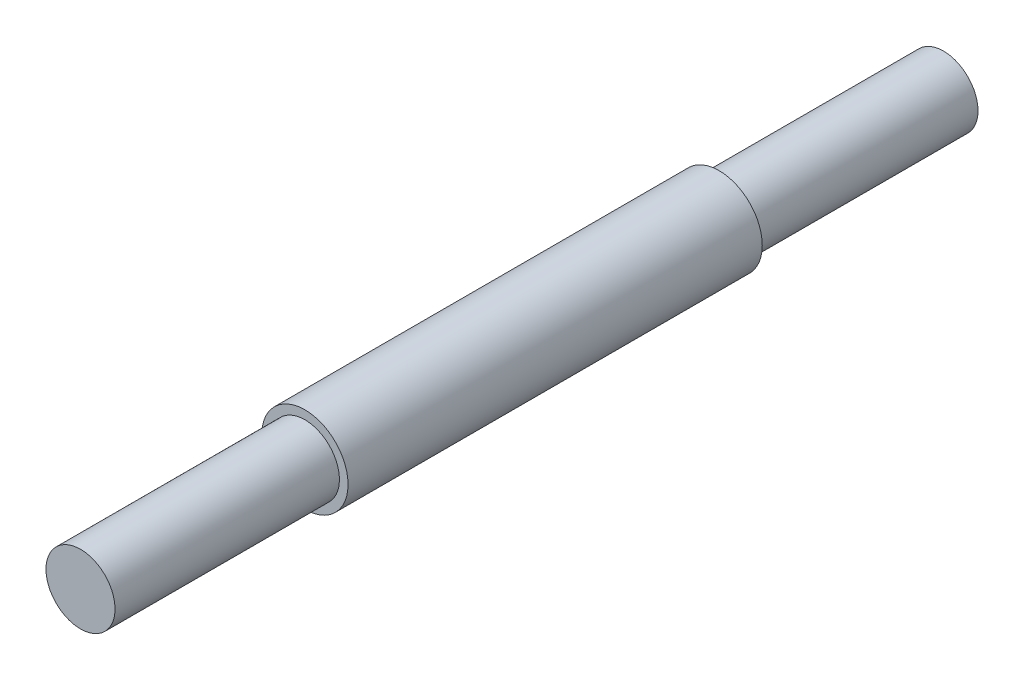
ISO-10303-21;
HEADER;
FILE_DESCRIPTION(('STEP AP214'),'2;1');
FILE_NAME('part.step','',(''),(''),'','','');
FILE_SCHEMA(('AUTOMOTIVE_DESIGN { 1 0 10303 214 1 1 1 1 }'));
ENDSEC;
DATA;
#1=APPLICATION_CONTEXT('core data for automotive mechanical design processes');
#2=APPLICATION_PROTOCOL_DEFINITION('international standard','automotive_design',2000,#1);
#3=PRODUCT_CONTEXT('',#1,'mechanical');
#4=PRODUCT('Part','Part','',(#3));
#5=PRODUCT_RELATED_PRODUCT_CATEGORY('part','',(#4));
#6=PRODUCT_DEFINITION_FORMATION('','',#4);
#7=PRODUCT_DEFINITION_CONTEXT('part definition',#1,'design');
#8=PRODUCT_DEFINITION('design','',#6,#7);
#9=PRODUCT_DEFINITION_SHAPE('','',#8);
#10=(LENGTH_UNIT() NAMED_UNIT(*) SI_UNIT(.MILLI.,.METRE.));
#11=(NAMED_UNIT(*) PLANE_ANGLE_UNIT() SI_UNIT($,.RADIAN.));
#12=(NAMED_UNIT(*) SI_UNIT($,.STERADIAN.) SOLID_ANGLE_UNIT());
#13=UNCERTAINTY_MEASURE_WITH_UNIT(LENGTH_MEASURE(1.E-05),#10,'distance_accuracy_value','');
#14=(GEOMETRIC_REPRESENTATION_CONTEXT(3) GLOBAL_UNCERTAINTY_ASSIGNED_CONTEXT((#13)) GLOBAL_UNIT_ASSIGNED_CONTEXT((#10,
#11,#12)) REPRESENTATION_CONTEXT('',''));
#15=CARTESIAN_POINT('',(0.,0.,0.));
#16=DIRECTION('',(0.,0.,1.));
#17=DIRECTION('',(1.,0.,0.));
#18=AXIS2_PLACEMENT_3D('',#15,#16,#17);
#19=CARTESIAN_POINT('',(0.,0.,-24.));
#20=DIRECTION('',(0.,0.,1.));
#21=DIRECTION('',(1.,0.,0.));
#22=AXIS2_PLACEMENT_3D('',#19,#20,#21);
#23=CYLINDRICAL_SURFACE('',#22,2.5);
#24=CARTESIAN_POINT('',(0.,0.,-24.));
#25=DIRECTION('',(0.,0.,1.));
#26=DIRECTION('',(1.,0.,0.));
#27=AXIS2_PLACEMENT_3D('',#24,#25,#26);
#28=CIRCLE('',#27,2.5);
#29=CARTESIAN_POINT('',(2.5,0.,-24.));
#30=VERTEX_POINT('',#29);
#31=EDGE_CURVE('E39',#30,#30,#28,.T.);
#32=ORIENTED_EDGE('',*,*,#31,.T.);
#33=EDGE_LOOP('',(#32));
#34=FACE_BOUND('',#33,.T.);
#35=CARTESIAN_POINT('',(0.,0.,0.));
#36=DIRECTION('',(0.,0.,1.));
#37=DIRECTION('',(1.,0.,0.));
#38=AXIS2_PLACEMENT_3D('',#35,#36,#37);
#39=CIRCLE('',#38,2.5);
#40=CARTESIAN_POINT('',(2.5,0.,0.));
#41=VERTEX_POINT('',#40);
#42=EDGE_CURVE('E43',#41,#41,#39,.T.);
#43=ORIENTED_EDGE('',*,*,#42,.F.);
#44=EDGE_LOOP('',(#43));
#45=FACE_BOUND('',#44,.T.);
#46=ADVANCED_FACE('F33',(#34,#45),#23,.T.);
#47=CARTESIAN_POINT('',(0.,0.,-24.));
#48=DIRECTION('',(0.,0.,1.));
#49=DIRECTION('',(1.,0.,0.));
#50=AXIS2_PLACEMENT_3D('',#47,#48,#49);
#51=PLANE('',#50);
#52=CARTESIAN_POINT('',(0.,0.,-24.));
#53=DIRECTION('',(0.,0.,1.));
#54=DIRECTION('',(1.,0.,0.));
#55=AXIS2_PLACEMENT_3D('',#52,#53,#54);
#56=CIRCLE('',#55,2.);
#57=CARTESIAN_POINT('',(2.,0.,-24.));
#58=VERTEX_POINT('',#57);
#59=EDGE_CURVE('E10',#58,#58,#56,.F.);
#60=ORIENTED_EDGE('',*,*,#59,.F.);
#61=EDGE_LOOP('',(#60));
#62=FACE_BOUND('',#61,.T.);
#63=ORIENTED_EDGE('',*,*,#31,.F.);
#64=EDGE_LOOP('',(#63));
#65=FACE_BOUND('',#64,.T.);
#66=ADVANCED_FACE('F74',(#62,#65),#51,.F.);
#67=CARTESIAN_POINT('',(0.,0.,0.));
#68=DIRECTION('',(0.,0.,1.));
#69=DIRECTION('',(1.,0.,0.));
#70=AXIS2_PLACEMENT_3D('',#67,#68,#69);
#71=PLANE('',#70);
#72=CARTESIAN_POINT('',(0.,0.,0.));
#73=DIRECTION('',(0.,0.,1.));
#74=DIRECTION('',(1.,0.,0.));
#75=AXIS2_PLACEMENT_3D('',#72,#73,#74);
#76=CIRCLE('',#75,2.);
#77=CARTESIAN_POINT('',(-2.,0.,0.));
#78=VERTEX_POINT('',#77);
#79=EDGE_CURVE('E50',#78,#78,#76,.T.);
#80=ORIENTED_EDGE('',*,*,#79,.F.);
#81=EDGE_LOOP('',(#80));
#82=FACE_BOUND('',#81,.T.);
#83=ORIENTED_EDGE('',*,*,#42,.T.);
#84=EDGE_LOOP('',(#83));
#85=FACE_BOUND('',#84,.T.);
#86=ADVANCED_FACE('F78',(#82,#85),#71,.T.);
#87=CARTESIAN_POINT('',(0.,0.,13.));
#88=DIRECTION('',(0.,0.,-1.));
#89=DIRECTION('',(-1.,0.,0.));
#90=AXIS2_PLACEMENT_3D('',#87,#88,#89);
#91=CYLINDRICAL_SURFACE('',#90,2.);
#92=CARTESIAN_POINT('',(0.,0.,13.));
#93=DIRECTION('',(0.,0.,1.));
#94=DIRECTION('',(1.,0.,0.));
#95=AXIS2_PLACEMENT_3D('',#92,#93,#94);
#96=CIRCLE('',#95,2.);
#97=CARTESIAN_POINT('',(-2.,0.,13.));
#98=VERTEX_POINT('',#97);
#99=EDGE_CURVE('E48',#98,#98,#96,.T.);
#100=CARTESIAN_POINT('',(-2.,0.,13.));
#101=CARTESIAN_POINT('',(-2.,0.,12.8645833333333));
#102=CARTESIAN_POINT('',(-2.,0.,12.7291666666667));
#103=CARTESIAN_POINT('',(-2.,0.,12.4583333333333));
#104=CARTESIAN_POINT('',(-2.,0.,12.3229166666667));
#105=CARTESIAN_POINT('',(-2.,0.,12.0520833333333));
#106=CARTESIAN_POINT('',(-2.,0.,11.9166666666667));
#107=CARTESIAN_POINT('',(-2.,0.,11.6458333333333));
#108=CARTESIAN_POINT('',(-2.,0.,11.5104166666667));
#109=CARTESIAN_POINT('',(-2.,0.,11.2395833333333));
#110=CARTESIAN_POINT('',(-2.,0.,11.1041666666667));
#111=CARTESIAN_POINT('',(-2.,0.,10.8333333333333));
#112=CARTESIAN_POINT('',(-2.,0.,10.6979166666667));
#113=CARTESIAN_POINT('',(-2.,0.,10.4270833333333));
#114=CARTESIAN_POINT('',(-2.,0.,10.2916666666667));
#115=CARTESIAN_POINT('',(-2.,0.,10.0208333333333));
#116=CARTESIAN_POINT('',(-2.,0.,9.88541666666667));
#117=CARTESIAN_POINT('',(-2.,0.,9.61458333333333));
#118=CARTESIAN_POINT('',(-2.,0.,9.47916666666667));
#119=CARTESIAN_POINT('',(-2.,0.,9.20833333333333));
#120=CARTESIAN_POINT('',(-2.,0.,9.07291666666666));
#121=CARTESIAN_POINT('',(-2.,0.,8.80208333333333));
#122=CARTESIAN_POINT('',(-2.,0.,8.66666666666667));
#123=CARTESIAN_POINT('',(-2.,0.,8.39583333333333));
#124=CARTESIAN_POINT('',(-2.,0.,8.26041666666667));
#125=CARTESIAN_POINT('',(-2.,0.,7.98958333333333));
#126=CARTESIAN_POINT('',(-2.,0.,7.85416666666667));
#127=CARTESIAN_POINT('',(-2.,0.,7.58333333333333));
#128=CARTESIAN_POINT('',(-2.,0.,7.44791666666667));
#129=CARTESIAN_POINT('',(-2.,0.,7.17708333333333));
#130=CARTESIAN_POINT('',(-2.,0.,7.04166666666667));
#131=CARTESIAN_POINT('',(-2.,0.,6.77083333333333));
#132=CARTESIAN_POINT('',(-2.,0.,6.63541666666667));
#133=CARTESIAN_POINT('',(-2.,0.,6.36458333333333));
#134=CARTESIAN_POINT('',(-2.,0.,6.22916666666667));
#135=CARTESIAN_POINT('',(-2.,0.,5.95833333333333));
#136=CARTESIAN_POINT('',(-2.,0.,5.82291666666667));
#137=CARTESIAN_POINT('',(-2.,0.,5.55208333333333));
#138=CARTESIAN_POINT('',(-2.,0.,5.41666666666667));
#139=CARTESIAN_POINT('',(-2.,0.,5.14583333333333));
#140=CARTESIAN_POINT('',(-2.,0.,5.01041666666667));
#141=CARTESIAN_POINT('',(-2.,0.,4.73958333333333));
#142=CARTESIAN_POINT('',(-2.,0.,4.60416666666667));
#143=CARTESIAN_POINT('',(-2.,0.,4.33333333333333));
#144=CARTESIAN_POINT('',(-2.,0.,4.19791666666667));
#145=CARTESIAN_POINT('',(-2.,0.,3.92708333333333));
#146=CARTESIAN_POINT('',(-2.,0.,3.79166666666667));
#147=CARTESIAN_POINT('',(-2.,0.,3.52083333333333));
#148=CARTESIAN_POINT('',(-2.,0.,3.38541666666667));
#149=CARTESIAN_POINT('',(-2.,0.,3.11458333333333));
#150=CARTESIAN_POINT('',(-2.,0.,2.97916666666667));
#151=CARTESIAN_POINT('',(-2.,0.,2.70833333333333));
#152=CARTESIAN_POINT('',(-2.,0.,2.57291666666667));
#153=CARTESIAN_POINT('',(-2.,0.,2.30208333333333));
#154=CARTESIAN_POINT('',(-2.,0.,2.16666666666667));
#155=CARTESIAN_POINT('',(-2.,0.,1.89583333333333));
#156=CARTESIAN_POINT('',(-2.,0.,1.76041666666667));
#157=CARTESIAN_POINT('',(-2.,0.,1.48958333333333));
#158=CARTESIAN_POINT('',(-2.,0.,1.35416666666667));
#159=CARTESIAN_POINT('',(-2.,0.,1.08333333333333));
#160=CARTESIAN_POINT('',(-2.,0.,0.947916666666667));
#161=CARTESIAN_POINT('',(-2.,0.,0.677083333333334));
#162=CARTESIAN_POINT('',(-2.,0.,0.541666666666667));
#163=CARTESIAN_POINT('',(-2.,0.,0.270833333333334));
#164=CARTESIAN_POINT('',(-2.,0.,0.135416666666667));
#165=CARTESIAN_POINT('',(-2.,0.,0.));
#166=B_SPLINE_CURVE_WITH_KNOTS('',3,(#100,#101,#102,#103,#104,#105,#106,#107,#108,#109,#110,
#111,#112,#113,#114,#115,#116,#117,#118,#119,#120,#121,#122,#123,#124,#125,#126,#127,#128,#129,
#130,#131,#132,#133,#134,#135,#136,#137,#138,#139,#140,#141,#142,#143,#144,#145,#146,#147,#148,
#149,#150,#151,#152,#153,#154,#155,#156,#157,#158,#159,#160,#161,#162,#163,#164,#165),
.UNSPECIFIED.,.F.,.F.,(4,2,2,2,2,2,2,2,2,2,2,2,2,2,2,2,2,2,2,2,2,2,2,2,2,2,2,2,2,2,2,2,4),(0.,
0.40625,0.812500000000001,1.21875,1.625,2.03125,2.4375,2.84375,3.25,3.65625,4.0625,4.46875,
4.875,5.28125,5.6875,6.09375,6.5,6.90625,7.3125,7.71875,8.125,8.53125,8.9375,9.34375,9.75,
10.15625,10.5625,10.96875,11.375,11.78125,12.1875,12.59375,13.),.UNSPECIFIED.);
#167=EDGE_CURVE('BSEAM70',#98,#78,#166,.T.);
#168=ORIENTED_EDGE('',*,*,#99,.F.);
#169=ORIENTED_EDGE('',*,*,#79,.T.);
#170=ORIENTED_EDGE('',*,*,#167,.T.);
#171=ORIENTED_EDGE('',*,*,#167,.F.);
#172=EDGE_LOOP('',(#168,#170,#169,#171));
#173=FACE_BOUND('',#172,.T.);
#174=ADVANCED_FACE('F70',(#173),#91,.T.);
#175=CARTESIAN_POINT('',(0.,0.,13.));
#176=DIRECTION('',(0.,0.,1.));
#177=DIRECTION('',(1.,0.,0.));
#178=AXIS2_PLACEMENT_3D('',#175,#176,#177);
#179=PLANE('',#178);
#180=ORIENTED_EDGE('',*,*,#99,.T.);
#181=EDGE_LOOP('',(#180));
#182=FACE_BOUND('',#181,.T.);
#183=ADVANCED_FACE('F63',(#182),#179,.T.);
#184=CARTESIAN_POINT('',(0.,0.,-37.));
#185=DIRECTION('',(0.,0.,1.));
#186=DIRECTION('',(1.,0.,0.));
#187=AXIS2_PLACEMENT_3D('',#184,#185,#186);
#188=CYLINDRICAL_SURFACE('',#187,2.);
#189=CARTESIAN_POINT('',(0.,0.,-37.));
#190=DIRECTION('',(0.,0.,-1.));
#191=DIRECTION('',(-1.,0.,0.));
#192=AXIS2_PLACEMENT_3D('',#189,#190,#191);
#193=CIRCLE('',#192,2.);
#194=CARTESIAN_POINT('',(2.,0.,-37.));
#195=VERTEX_POINT('',#194);
#196=EDGE_CURVE('E53',#195,#195,#193,.T.);
#197=CARTESIAN_POINT('',(2.,0.,-37.));
#198=CARTESIAN_POINT('',(2.,0.,-36.8645833333333));
#199=CARTESIAN_POINT('',(2.,0.,-36.7291666666667));
#200=CARTESIAN_POINT('',(2.,0.,-36.4583333333333));
#201=CARTESIAN_POINT('',(2.,0.,-36.3229166666667));
#202=CARTESIAN_POINT('',(2.,0.,-36.0520833333333));
#203=CARTESIAN_POINT('',(2.,0.,-35.9166666666667));
#204=CARTESIAN_POINT('',(2.,0.,-35.6458333333333));
#205=CARTESIAN_POINT('',(2.,0.,-35.5104166666667));
#206=CARTESIAN_POINT('',(2.,0.,-35.2395833333333));
#207=CARTESIAN_POINT('',(2.,0.,-35.1041666666667));
#208=CARTESIAN_POINT('',(2.,0.,-34.8333333333333));
#209=CARTESIAN_POINT('',(2.,0.,-34.6979166666667));
#210=CARTESIAN_POINT('',(2.,0.,-34.4270833333333));
#211=CARTESIAN_POINT('',(2.,0.,-34.2916666666667));
#212=CARTESIAN_POINT('',(2.,0.,-34.0208333333333));
#213=CARTESIAN_POINT('',(2.,0.,-33.8854166666667));
#214=CARTESIAN_POINT('',(2.,0.,-33.6145833333333));
#215=CARTESIAN_POINT('',(2.,0.,-33.4791666666667));
#216=CARTESIAN_POINT('',(2.,0.,-33.2083333333333));
#217=CARTESIAN_POINT('',(2.,0.,-33.0729166666667));
#218=CARTESIAN_POINT('',(2.,0.,-32.8020833333333));
#219=CARTESIAN_POINT('',(2.,0.,-32.6666666666667));
#220=CARTESIAN_POINT('',(2.,0.,-32.3958333333333));
#221=CARTESIAN_POINT('',(2.,0.,-32.2604166666667));
#222=CARTESIAN_POINT('',(2.,0.,-31.9895833333333));
#223=CARTESIAN_POINT('',(2.,0.,-31.8541666666667));
#224=CARTESIAN_POINT('',(2.,0.,-31.5833333333333));
#225=CARTESIAN_POINT('',(2.,0.,-31.4479166666667));
#226=CARTESIAN_POINT('',(2.,0.,-31.1770833333333));
#227=CARTESIAN_POINT('',(2.,0.,-31.0416666666667));
#228=CARTESIAN_POINT('',(2.,0.,-30.7708333333333));
#229=CARTESIAN_POINT('',(2.,0.,-30.6354166666667));
#230=CARTESIAN_POINT('',(2.,0.,-30.3645833333333));
#231=CARTESIAN_POINT('',(2.,0.,-30.2291666666667));
#232=CARTESIAN_POINT('',(2.,0.,-29.9583333333333));
#233=CARTESIAN_POINT('',(2.,0.,-29.8229166666667));
#234=CARTESIAN_POINT('',(2.,0.,-29.5520833333333));
#235=CARTESIAN_POINT('',(2.,0.,-29.4166666666667));
#236=CARTESIAN_POINT('',(2.,0.,-29.1458333333333));
#237=CARTESIAN_POINT('',(2.,0.,-29.0104166666667));
#238=CARTESIAN_POINT('',(2.,0.,-28.7395833333333));
#239=CARTESIAN_POINT('',(2.,0.,-28.6041666666667));
#240=CARTESIAN_POINT('',(2.,0.,-28.3333333333333));
#241=CARTESIAN_POINT('',(2.,0.,-28.1979166666667));
#242=CARTESIAN_POINT('',(2.,0.,-27.9270833333333));
#243=CARTESIAN_POINT('',(2.,0.,-27.7916666666667));
#244=CARTESIAN_POINT('',(2.,0.,-27.5208333333333));
#245=CARTESIAN_POINT('',(2.,0.,-27.3854166666667));
#246=CARTESIAN_POINT('',(2.,0.,-27.1145833333333));
#247=CARTESIAN_POINT('',(2.,0.,-26.9791666666667));
#248=CARTESIAN_POINT('',(2.,0.,-26.7083333333333));
#249=CARTESIAN_POINT('',(2.,0.,-26.5729166666667));
#250=CARTESIAN_POINT('',(2.,0.,-26.3020833333333));
#251=CARTESIAN_POINT('',(2.,0.,-26.1666666666667));
#252=CARTESIAN_POINT('',(2.,0.,-25.8958333333333));
#253=CARTESIAN_POINT('',(2.,0.,-25.7604166666667));
#254=CARTESIAN_POINT('',(2.,0.,-25.4895833333333));
#255=CARTESIAN_POINT('',(2.,0.,-25.3541666666667));
#256=CARTESIAN_POINT('',(2.,0.,-25.0833333333333));
#257=CARTESIAN_POINT('',(2.,0.,-24.9479166666667));
#258=CARTESIAN_POINT('',(2.,0.,-24.6770833333333));
#259=CARTESIAN_POINT('',(2.,0.,-24.5416666666667));
#260=CARTESIAN_POINT('',(2.,0.,-24.2708333333333));
#261=CARTESIAN_POINT('',(2.,0.,-24.1354166666667));
#262=CARTESIAN_POINT('',(2.,0.,-24.));
#263=B_SPLINE_CURVE_WITH_KNOTS('',3,(#197,#198,#199,#200,#201,#202,#203,#204,#205,#206,#207,
#208,#209,#210,#211,#212,#213,#214,#215,#216,#217,#218,#219,#220,#221,#222,#223,#224,#225,#226,
#227,#228,#229,#230,#231,#232,#233,#234,#235,#236,#237,#238,#239,#240,#241,#242,#243,#244,#245,
#246,#247,#248,#249,#250,#251,#252,#253,#254,#255,#256,#257,#258,#259,#260,#261,#262),
.UNSPECIFIED.,.F.,.F.,(4,2,2,2,2,2,2,2,2,2,2,2,2,2,2,2,2,2,2,2,2,2,2,2,2,2,2,2,2,2,2,2,4),(0.,
0.406249999999997,0.812499999999994,1.21875,1.62499999999999,2.03125,2.4375,2.84374999999999,
3.25,3.65624999999999,4.0625,4.46874999999999,4.87499999999999,5.28124999999999,
5.68749999999999,6.09374999999999,6.49999999999999,6.90624999999999,7.31249999999999,
7.71874999999999,8.12499999999999,8.53124999999999,8.93749999999999,9.34374999999999,
9.74999999999999,10.15625,10.5625,10.96875,11.375,11.78125,12.1875,12.59375,13.),.UNSPECIFIED.);
#264=EDGE_CURVE('BSEAM61',#195,#58,#263,.T.);
#265=ORIENTED_EDGE('',*,*,#196,.F.);
#266=ORIENTED_EDGE('',*,*,#59,.T.);
#267=ORIENTED_EDGE('',*,*,#264,.T.);
#268=ORIENTED_EDGE('',*,*,#264,.F.);
#269=EDGE_LOOP('',(#265,#267,#266,#268));
#270=FACE_BOUND('',#269,.T.);
#271=ADVANCED_FACE('F61',(#270),#188,.T.);
#272=CARTESIAN_POINT('',(0.,0.,-37.));
#273=DIRECTION('',(0.,0.,-1.));
#274=DIRECTION('',(-1.,0.,0.));
#275=AXIS2_PLACEMENT_3D('',#272,#273,#274);
#276=PLANE('',#275);
#277=ORIENTED_EDGE('',*,*,#196,.T.);
#278=EDGE_LOOP('',(#277));
#279=FACE_BOUND('',#278,.T.);
#280=ADVANCED_FACE('F59',(#279),#276,.T.);
#281=CLOSED_SHELL('',(#46,#66,#86,#174,#183,#271,#280));
#282=MANIFOLD_SOLID_BREP('B2',#281);
#283=ADVANCED_BREP_SHAPE_REPRESENTATION('',(#18,#282),#14);
#284=SHAPE_DEFINITION_REPRESENTATION(#9,#283);
ENDSEC;
END-ISO-10303-21;
